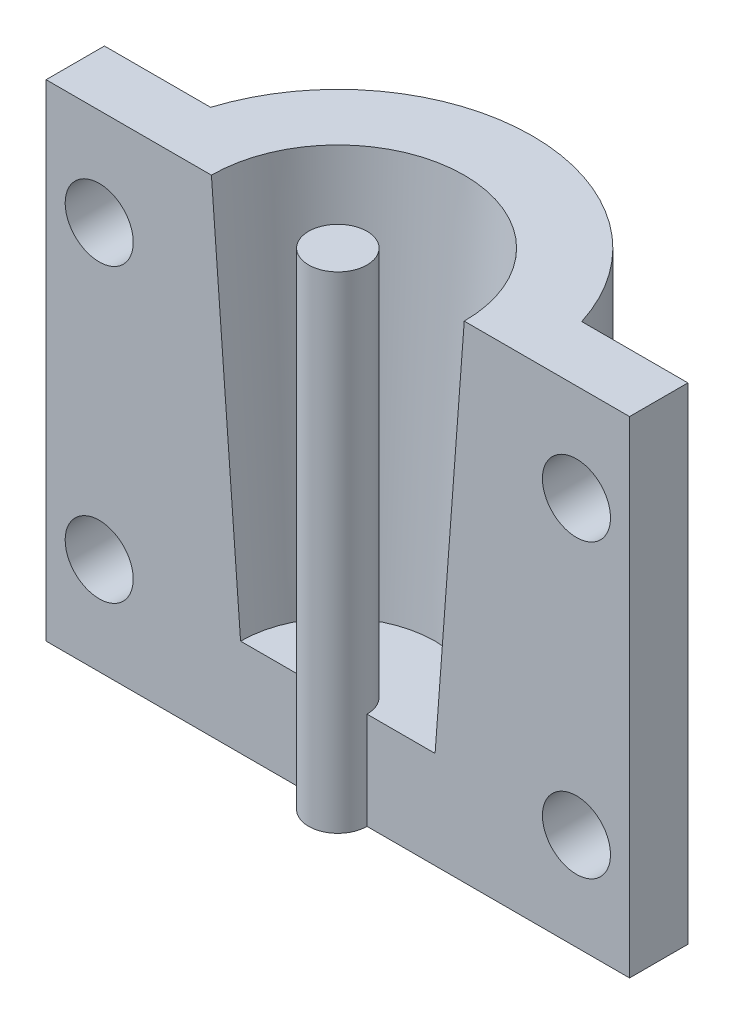
ISO-10303-21;
HEADER;
FILE_DESCRIPTION(('STEP AP214'),'2;1');
FILE_NAME('part.step','',(''),(''),'','','');
FILE_SCHEMA(('AUTOMOTIVE_DESIGN { 1 0 10303 214 1 1 1 1 }'));
ENDSEC;
DATA;
#1=APPLICATION_CONTEXT('core data for automotive mechanical design processes');
#2=APPLICATION_PROTOCOL_DEFINITION('international standard','automotive_design',2000,#1);
#3=PRODUCT_CONTEXT('',#1,'mechanical');
#4=PRODUCT('Part','Part','',(#3));
#5=PRODUCT_RELATED_PRODUCT_CATEGORY('part','',(#4));
#6=PRODUCT_DEFINITION_FORMATION('','',#4);
#7=PRODUCT_DEFINITION_CONTEXT('part definition',#1,'design');
#8=PRODUCT_DEFINITION('design','',#6,#7);
#9=PRODUCT_DEFINITION_SHAPE('','',#8);
#10=(LENGTH_UNIT() NAMED_UNIT(*) SI_UNIT(.MILLI.,.METRE.));
#11=(NAMED_UNIT(*) PLANE_ANGLE_UNIT() SI_UNIT($,.RADIAN.));
#12=(NAMED_UNIT(*) SI_UNIT($,.STERADIAN.) SOLID_ANGLE_UNIT());
#13=UNCERTAINTY_MEASURE_WITH_UNIT(LENGTH_MEASURE(1.E-05),#10,'distance_accuracy_value','');
#14=(GEOMETRIC_REPRESENTATION_CONTEXT(3) GLOBAL_UNCERTAINTY_ASSIGNED_CONTEXT((#13)) GLOBAL_UNIT_ASSIGNED_CONTEXT((#10,
#11,#12)) REPRESENTATION_CONTEXT('',''));
#15=CARTESIAN_POINT('',(0.,0.,0.));
#16=DIRECTION('',(0.,0.,1.));
#17=DIRECTION('',(1.,0.,0.));
#18=AXIS2_PLACEMENT_3D('',#15,#16,#17);
#19=CARTESIAN_POINT('',(0.,25.,0.));
#20=DIRECTION('',(0.,-1.,0.));
#21=DIRECTION('',(0.,0.,-1.));
#22=AXIS2_PLACEMENT_3D('',#19,#20,#21);
#23=CYLINDRICAL_SURFACE('',#22,10.);
#24=CARTESIAN_POINT('',(0.,25.,0.));
#25=DIRECTION('',(0.,1.,0.));
#26=DIRECTION('',(0.,0.,1.));
#27=AXIS2_PLACEMENT_3D('',#24,#25,#26);
#28=CIRCLE('',#27,10.);
#29=CARTESIAN_POINT('',(9.53939201416946,25.,-3.));
#30=VERTEX_POINT('',#29);
#31=CARTESIAN_POINT('',(-9.53939201416946,25.,-3.));
#32=VERTEX_POINT('',#31);
#33=EDGE_CURVE('E76',#30,#32,#28,.T.);
#34=ORIENTED_EDGE('',*,*,#33,.F.);
#35=DIRECTION('',(0.,-1.,0.));
#36=VECTOR('',#35,1.);
#37=CARTESIAN_POINT('',(9.53939201416946,25.,-3.));
#38=LINE('',#37,#36);
#39=CARTESIAN_POINT('',(9.53939201416946,0.,-3.));
#40=VERTEX_POINT('',#39);
#41=EDGE_CURVE('E165',#30,#40,#38,.T.);
#42=ORIENTED_EDGE('',*,*,#41,.T.);
#43=CARTESIAN_POINT('',(0.,0.,0.));
#44=DIRECTION('',(0.,1.,0.));
#45=DIRECTION('',(0.,0.,1.));
#46=AXIS2_PLACEMENT_3D('',#43,#44,#45);
#47=CIRCLE('',#46,10.);
#48=CARTESIAN_POINT('',(-9.53939201416946,0.,-3.));
#49=VERTEX_POINT('',#48);
#50=EDGE_CURVE('E311',#40,#49,#47,.T.);
#51=ORIENTED_EDGE('',*,*,#50,.T.);
#52=DIRECTION('',(0.,-1.,0.));
#53=VECTOR('',#52,1.);
#54=CARTESIAN_POINT('',(-9.53939201416946,25.,-3.));
#55=LINE('',#54,#53);
#56=EDGE_CURVE('E257',#32,#49,#55,.T.);
#57=ORIENTED_EDGE('',*,*,#56,.F.);
#58=EDGE_LOOP('',(#34,#42,#51,#57));
#59=FACE_BOUND('',#58,.T.);
#60=ADVANCED_FACE('F67',(#59),#23,.T.);
#61=CARTESIAN_POINT('',(0.,25.,0.));
#62=DIRECTION('',(0.,1.,0.));
#63=DIRECTION('',(0.,0.,1.));
#64=AXIS2_PLACEMENT_3D('',#61,#62,#63);
#65=PLANE('',#64);
#66=CARTESIAN_POINT('',(0.,25.,0.));
#67=DIRECTION('',(0.,1.,0.));
#68=DIRECTION('',(0.,0.,1.));
#69=AXIS2_PLACEMENT_3D('',#66,#67,#68);
#70=CIRCLE('',#69,6.5);
#71=CARTESIAN_POINT('',(-6.5,25.,0.));
#72=VERTEX_POINT('',#71);
#73=CARTESIAN_POINT('',(6.5,25.,0.));
#74=VERTEX_POINT('',#73);
#75=EDGE_CURVE('E149',#72,#74,#70,.F.);
#76=ORIENTED_EDGE('',*,*,#75,.T.);
#77=DIRECTION('',(-1.,0.,0.));
#78=VECTOR('',#77,1.);
#79=CARTESIAN_POINT('',(10.,25.,0.));
#80=LINE('',#79,#78);
#81=CARTESIAN_POINT('',(15.,25.,0.));
#82=VERTEX_POINT('',#81);
#83=EDGE_CURVE('E143',#82,#74,#80,.T.);
#84=ORIENTED_EDGE('',*,*,#83,.F.);
#85=DIRECTION('',(0.,0.,1.));
#86=VECTOR('',#85,1.);
#87=CARTESIAN_POINT('',(15.,25.,-3.));
#88=LINE('',#87,#86);
#89=CARTESIAN_POINT('',(15.,25.,-3.));
#90=VERTEX_POINT('',#89);
#91=EDGE_CURVE('E147',#90,#82,#88,.T.);
#92=ORIENTED_EDGE('',*,*,#91,.F.);
#93=DIRECTION('',(1.,0.,0.));
#94=VECTOR('',#93,1.);
#95=CARTESIAN_POINT('',(7.74522459408944,25.,-3.));
#96=LINE('',#95,#94);
#97=EDGE_CURVE('E172',#30,#90,#96,.T.);
#98=ORIENTED_EDGE('',*,*,#97,.F.);
#99=ORIENTED_EDGE('',*,*,#33,.T.);
#100=DIRECTION('',(-1.,0.,0.));
#101=VECTOR('',#100,1.);
#102=CARTESIAN_POINT('',(-7.74522459408944,25.,-3.));
#103=LINE('',#102,#101);
#104=CARTESIAN_POINT('',(-15.,25.,-3.));
#105=VERTEX_POINT('',#104);
#106=EDGE_CURVE('E234',#32,#105,#103,.T.);
#107=ORIENTED_EDGE('',*,*,#106,.T.);
#108=DIRECTION('',(0.,0.,1.));
#109=VECTOR('',#108,1.);
#110=CARTESIAN_POINT('',(-15.,25.,-3.));
#111=LINE('',#110,#109);
#112=CARTESIAN_POINT('',(-15.,25.,0.));
#113=VERTEX_POINT('',#112);
#114=EDGE_CURVE('E237',#105,#113,#111,.T.);
#115=ORIENTED_EDGE('',*,*,#114,.T.);
#116=DIRECTION('',(1.,0.,0.));
#117=VECTOR('',#116,1.);
#118=CARTESIAN_POINT('',(-7.74522459408944,25.,0.));
#119=LINE('',#118,#117);
#120=EDGE_CURVE('E241',#113,#72,#119,.T.);
#121=ORIENTED_EDGE('',*,*,#120,.T.);
#122=EDGE_LOOP('',(#76,#84,#92,#98,#99,#107,#115,#121));
#123=FACE_BOUND('',#122,.T.);
#124=ADVANCED_FACE('F145',(#123),#65,.T.);
#125=CARTESIAN_POINT('',(0.,0.,0.));
#126=DIRECTION('',(0.,1.,0.));
#127=DIRECTION('',(0.,0.,1.));
#128=AXIS2_PLACEMENT_3D('',#125,#126,#127);
#129=PLANE('',#128);
#130=DIRECTION('',(-1.,0.,0.));
#131=VECTOR('',#130,1.);
#132=CARTESIAN_POINT('',(10.,0.,0.));
#133=LINE('',#132,#131);
#134=CARTESIAN_POINT('',(15.,0.,0.));
#135=VERTEX_POINT('',#134);
#136=CARTESIAN_POINT('',(1.5,0.,0.));
#137=VERTEX_POINT('',#136);
#138=EDGE_CURVE('E160',#135,#137,#133,.T.);
#139=ORIENTED_EDGE('',*,*,#138,.T.);
#140=CARTESIAN_POINT('',(0.,0.,0.));
#141=DIRECTION('',(0.,-1.,0.));
#142=DIRECTION('',(0.,0.,1.));
#143=AXIS2_PLACEMENT_3D('',#140,#141,#142);
#144=CIRCLE('',#143,1.5);
#145=CARTESIAN_POINT('',(-1.5,0.,0.));
#146=VERTEX_POINT('',#145);
#147=EDGE_CURVE('E154',#137,#146,#144,.T.);
#148=ORIENTED_EDGE('',*,*,#147,.T.);
#149=DIRECTION('',(1.,0.,0.));
#150=VECTOR('',#149,1.);
#151=CARTESIAN_POINT('',(-7.74522459408944,0.,0.));
#152=LINE('',#151,#150);
#153=CARTESIAN_POINT('',(-15.,0.,0.));
#154=VERTEX_POINT('',#153);
#155=EDGE_CURVE('E238',#154,#146,#152,.T.);
#156=ORIENTED_EDGE('',*,*,#155,.F.);
#157=DIRECTION('',(0.,0.,1.));
#158=VECTOR('',#157,1.);
#159=CARTESIAN_POINT('',(-15.,0.,-3.));
#160=LINE('',#159,#158);
#161=CARTESIAN_POINT('',(-15.,0.,-3.));
#162=VERTEX_POINT('',#161);
#163=EDGE_CURVE('E244',#162,#154,#160,.T.);
#164=ORIENTED_EDGE('',*,*,#163,.F.);
#165=DIRECTION('',(-1.,0.,0.));
#166=VECTOR('',#165,1.);
#167=CARTESIAN_POINT('',(-7.74522459408944,0.,-3.));
#168=LINE('',#167,#166);
#169=EDGE_CURVE('E231',#49,#162,#168,.T.);
#170=ORIENTED_EDGE('',*,*,#169,.F.);
#171=ORIENTED_EDGE('',*,*,#50,.F.);
#172=DIRECTION('',(1.,0.,0.));
#173=VECTOR('',#172,1.);
#174=CARTESIAN_POINT('',(7.74522459408944,0.,-3.));
#175=LINE('',#174,#173);
#176=CARTESIAN_POINT('',(15.,0.,-3.));
#177=VERTEX_POINT('',#176);
#178=EDGE_CURVE('E173',#40,#177,#175,.T.);
#179=ORIENTED_EDGE('',*,*,#178,.T.);
#180=DIRECTION('',(0.,0.,1.));
#181=VECTOR('',#180,1.);
#182=CARTESIAN_POINT('',(15.,0.,-3.));
#183=LINE('',#182,#181);
#184=EDGE_CURVE('E178',#177,#135,#183,.T.);
#185=ORIENTED_EDGE('',*,*,#184,.T.);
#186=EDGE_LOOP('',(#139,#148,#156,#164,#170,#171,#179,#185));
#187=FACE_BOUND('',#186,.T.);
#188=ADVANCED_FACE('F285',(#187),#129,.F.);
#189=CARTESIAN_POINT('',(0.,5.,0.));
#190=DIRECTION('',(0.,1.,0.));
#191=DIRECTION('',(0.,0.,1.));
#192=AXIS2_PLACEMENT_3D('',#189,#190,#191);
#193=CONICAL_SURFACE('',#192,5.,0.0748598477107669);
#194=CARTESIAN_POINT('',(0.,5.,0.));
#195=DIRECTION('',(0.,1.,0.));
#196=DIRECTION('',(0.,0.,1.));
#197=AXIS2_PLACEMENT_3D('',#194,#195,#196);
#198=CIRCLE('',#197,5.);
#199=CARTESIAN_POINT('',(-5.00008660902664,5.,1.66282445554639E-07));
#200=VERTEX_POINT('',#199);
#201=CARTESIAN_POINT('',(5.00008660984891,5.,-1.67465392185179E-07));
#202=VERTEX_POINT('',#201);
#203=EDGE_CURVE('E265',#200,#202,#198,.F.);
#204=ORIENTED_EDGE('',*,*,#203,.T.);
#205=DIRECTION('',(-0.0747899482416342,-0.997199309888456,0.));
#206=VECTOR('',#205,1.);
#207=CARTESIAN_POINT('',(0.,-61.6666666666667,0.));
#208=LINE('',#207,#206);
#209=EDGE_CURVE('E226',#202,#74,#208,.F.);
#210=ORIENTED_EDGE('',*,*,#209,.T.);
#211=ORIENTED_EDGE('',*,*,#75,.F.);
#212=DIRECTION('',(-0.0747899482416342,0.997199309888456,0.));
#213=VECTOR('',#212,1.);
#214=CARTESIAN_POINT('',(0.,-61.6666666666667,0.));
#215=LINE('',#214,#213);
#216=EDGE_CURVE('E214',#72,#200,#215,.F.);
#217=ORIENTED_EDGE('',*,*,#216,.T.);
#218=EDGE_LOOP('',(#204,#210,#211,#217));
#219=FACE_BOUND('',#218,.T.);
#220=ADVANCED_FACE('F274',(#219),#193,.F.);
#221=CARTESIAN_POINT('',(0.,5.,0.));
#222=DIRECTION('',(0.,-1.,0.));
#223=DIRECTION('',(0.,0.,-1.));
#224=AXIS2_PLACEMENT_3D('',#221,#222,#223);
#225=PLANE('',#224);
#226=CARTESIAN_POINT('',(0.,5.,0.));
#227=DIRECTION('',(0.,-1.,0.));
#228=DIRECTION('',(0.,0.,-1.));
#229=AXIS2_PLACEMENT_3D('',#226,#227,#228);
#230=CIRCLE('',#229,1.5);
#231=CARTESIAN_POINT('',(1.5,5.,0.));
#232=VERTEX_POINT('',#231);
#233=CARTESIAN_POINT('',(-1.5,5.,0.));
#234=VERTEX_POINT('',#233);
#235=EDGE_CURVE('E12',#232,#234,#230,.F.);
#236=ORIENTED_EDGE('',*,*,#235,.F.);
#237=DIRECTION('',(1.,0.,0.));
#238=VECTOR('',#237,1.);
#239=CARTESIAN_POINT('',(0.,5.,0.));
#240=LINE('',#239,#238);
#241=EDGE_CURVE('E220',#232,#202,#240,.T.);
#242=ORIENTED_EDGE('',*,*,#241,.T.);
#243=ORIENTED_EDGE('',*,*,#203,.F.);
#244=DIRECTION('',(1.,0.,0.));
#245=VECTOR('',#244,1.);
#246=CARTESIAN_POINT('',(0.,5.,0.));
#247=LINE('',#246,#245);
#248=EDGE_CURVE('E210',#200,#234,#247,.T.);
#249=ORIENTED_EDGE('',*,*,#248,.T.);
#250=EDGE_LOOP('',(#236,#242,#243,#249));
#251=FACE_BOUND('',#250,.T.);
#252=ADVANCED_FACE('F284',(#251),#225,.F.);
#253=CARTESIAN_POINT('',(0.,25.,0.));
#254=DIRECTION('',(0.,-1.,0.));
#255=DIRECTION('',(0.,0.,-1.));
#256=AXIS2_PLACEMENT_3D('',#253,#254,#255);
#257=CYLINDRICAL_SURFACE('',#256,1.5);
#258=ORIENTED_EDGE('',*,*,#235,.T.);
#259=DIRECTION('',(0.,1.,0.));
#260=VECTOR('',#259,1.);
#261=CARTESIAN_POINT('',(-1.5,0.,0.));
#262=LINE('',#261,#260);
#263=EDGE_CURVE('E204',#146,#234,#262,.T.);
#264=ORIENTED_EDGE('',*,*,#263,.F.);
#265=ORIENTED_EDGE('',*,*,#147,.F.);
#266=DIRECTION('',(0.,1.,0.));
#267=VECTOR('',#266,1.);
#268=CARTESIAN_POINT('',(1.5,0.,0.));
#269=LINE('',#268,#267);
#270=EDGE_CURVE('E207',#137,#232,#269,.T.);
#271=ORIENTED_EDGE('',*,*,#270,.T.);
#272=EDGE_LOOP('',(#258,#264,#265,#271));
#273=FACE_BOUND('',#272,.T.);
#274=CARTESIAN_POINT('',(0.,25.,0.));
#275=DIRECTION('',(0.,1.,0.));
#276=DIRECTION('',(0.,0.,1.));
#277=AXIS2_PLACEMENT_3D('',#274,#275,#276);
#278=CIRCLE('',#277,1.5);
#279=CARTESIAN_POINT('',(0.,25.,1.5));
#280=VERTEX_POINT('',#279);
#281=EDGE_CURVE('E261',#280,#280,#278,.T.);
#282=ORIENTED_EDGE('',*,*,#281,.F.);
#283=EDGE_LOOP('',(#282));
#284=FACE_BOUND('',#283,.T.);
#285=ADVANCED_FACE('F357',(#273,#284),#257,.T.);
#286=CARTESIAN_POINT('',(0.,25.,0.));
#287=DIRECTION('',(0.,1.,0.));
#288=DIRECTION('',(0.,0.,1.));
#289=AXIS2_PLACEMENT_3D('',#286,#287,#288);
#290=PLANE('',#289);
#291=ORIENTED_EDGE('',*,*,#281,.T.);
#292=EDGE_LOOP('',(#291));
#293=FACE_BOUND('',#292,.T.);
#294=ADVANCED_FACE('F396',(#293),#290,.T.);
#295=CARTESIAN_POINT('',(-7.74522459408944,25.,-3.));
#296=DIRECTION('',(0.,0.,1.));
#297=DIRECTION('',(1.,0.,0.));
#298=AXIS2_PLACEMENT_3D('',#295,#296,#297);
#299=PLANE('',#298);
#300=CARTESIAN_POINT('',(-12.2696960070847,5.,-3.));
#301=DIRECTION('',(0.,0.,-1.));
#302=DIRECTION('',(-1.,0.,0.));
#303=AXIS2_PLACEMENT_3D('',#300,#301,#302);
#304=CIRCLE('',#303,1.75);
#305=CARTESIAN_POINT('',(-14.0196960070847,5.,-3.));
#306=VERTEX_POINT('',#305);
#307=EDGE_CURVE('E191',#306,#306,#304,.T.);
#308=ORIENTED_EDGE('',*,*,#307,.F.);
#309=EDGE_LOOP('',(#308));
#310=FACE_BOUND('',#309,.T.);
#311=CARTESIAN_POINT('',(-12.2696960070847,20.,-3.));
#312=DIRECTION('',(0.,0.,-1.));
#313=DIRECTION('',(-1.,0.,0.));
#314=AXIS2_PLACEMENT_3D('',#311,#312,#313);
#315=CIRCLE('',#314,1.75);
#316=CARTESIAN_POINT('',(-14.0196960070847,20.,-3.));
#317=VERTEX_POINT('',#316);
#318=EDGE_CURVE('E190',#317,#317,#315,.T.);
#319=ORIENTED_EDGE('',*,*,#318,.F.);
#320=EDGE_LOOP('',(#319));
#321=FACE_BOUND('',#320,.T.);
#322=ORIENTED_EDGE('',*,*,#106,.F.);
#323=ORIENTED_EDGE('',*,*,#56,.T.);
#324=ORIENTED_EDGE('',*,*,#169,.T.);
#325=DIRECTION('',(0.,-1.,0.));
#326=VECTOR('',#325,1.);
#327=CARTESIAN_POINT('',(-15.,25.,-3.));
#328=LINE('',#327,#326);
#329=EDGE_CURVE('E253',#105,#162,#328,.T.);
#330=ORIENTED_EDGE('',*,*,#329,.F.);
#331=EDGE_LOOP('',(#322,#323,#324,#330));
#332=FACE_BOUND('',#331,.T.);
#333=ADVANCED_FACE('F374',(#310,#321,#332),#299,.F.);
#334=CARTESIAN_POINT('',(-7.74522459408944,25.,0.));
#335=DIRECTION('',(0.,0.,-1.));
#336=DIRECTION('',(-1.,0.,0.));
#337=AXIS2_PLACEMENT_3D('',#334,#335,#336);
#338=PLANE('',#337);
#339=CARTESIAN_POINT('',(-12.2696960070847,5.,0.));
#340=DIRECTION('',(0.,0.,-1.));
#341=DIRECTION('',(-1.,0.,0.));
#342=AXIS2_PLACEMENT_3D('',#339,#340,#341);
#343=CIRCLE('',#342,1.75);
#344=CARTESIAN_POINT('',(-14.0196960070847,5.,0.));
#345=VERTEX_POINT('',#344);
#346=EDGE_CURVE('E70',#345,#345,#343,.T.);
#347=ORIENTED_EDGE('',*,*,#346,.T.);
#348=EDGE_LOOP('',(#347));
#349=FACE_BOUND('',#348,.T.);
#350=CARTESIAN_POINT('',(-12.2696960070847,20.,0.));
#351=DIRECTION('',(0.,0.,-1.));
#352=DIRECTION('',(-1.,0.,0.));
#353=AXIS2_PLACEMENT_3D('',#350,#351,#352);
#354=CIRCLE('',#353,1.75);
#355=CARTESIAN_POINT('',(-14.0196960070847,20.,0.));
#356=VERTEX_POINT('',#355);
#357=EDGE_CURVE('E195',#356,#356,#354,.T.);
#358=ORIENTED_EDGE('',*,*,#357,.T.);
#359=EDGE_LOOP('',(#358));
#360=FACE_BOUND('',#359,.T.);
#361=ORIENTED_EDGE('',*,*,#155,.T.);
#362=ORIENTED_EDGE('',*,*,#263,.T.);
#363=ORIENTED_EDGE('',*,*,#248,.F.);
#364=ORIENTED_EDGE('',*,*,#216,.F.);
#365=ORIENTED_EDGE('',*,*,#120,.F.);
#366=DIRECTION('',(0.,-1.,0.));
#367=VECTOR('',#366,1.);
#368=CARTESIAN_POINT('',(-15.,25.,0.));
#369=LINE('',#368,#367);
#370=EDGE_CURVE('E249',#113,#154,#369,.T.);
#371=ORIENTED_EDGE('',*,*,#370,.T.);
#372=EDGE_LOOP('',(#361,#362,#363,#364,#365,#371));
#373=FACE_BOUND('',#372,.T.);
#374=ADVANCED_FACE('F323',(#349,#360,#373),#338,.F.);
#375=CARTESIAN_POINT('',(-15.,25.,-3.));
#376=DIRECTION('',(1.,0.,0.));
#377=DIRECTION('',(0.,0.,-1.));
#378=AXIS2_PLACEMENT_3D('',#375,#376,#377);
#379=PLANE('',#378);
#380=ORIENTED_EDGE('',*,*,#163,.T.);
#381=ORIENTED_EDGE('',*,*,#370,.F.);
#382=ORIENTED_EDGE('',*,*,#114,.F.);
#383=ORIENTED_EDGE('',*,*,#329,.T.);
#384=EDGE_LOOP('',(#380,#381,#382,#383));
#385=FACE_BOUND('',#384,.T.);
#386=ADVANCED_FACE('F379',(#385),#379,.F.);
#387=CARTESIAN_POINT('',(10.,0.,0.));
#388=DIRECTION('',(0.,0.,-1.));
#389=DIRECTION('',(-1.,0.,0.));
#390=AXIS2_PLACEMENT_3D('',#387,#388,#389);
#391=PLANE('',#390);
#392=CARTESIAN_POINT('',(12.2696960070847,5.,0.));
#393=DIRECTION('',(0.,0.,-1.));
#394=DIRECTION('',(-1.,0.,0.));
#395=AXIS2_PLACEMENT_3D('',#392,#393,#394);
#396=CIRCLE('',#395,1.75);
#397=CARTESIAN_POINT('',(10.5196960070847,5.,0.));
#398=VERTEX_POINT('',#397);
#399=EDGE_CURVE('E181',#398,#398,#396,.F.);
#400=ORIENTED_EDGE('',*,*,#399,.F.);
#401=EDGE_LOOP('',(#400));
#402=FACE_BOUND('',#401,.T.);
#403=CARTESIAN_POINT('',(12.2696960070847,20.,0.));
#404=DIRECTION('',(0.,0.,-1.));
#405=DIRECTION('',(-1.,0.,0.));
#406=AXIS2_PLACEMENT_3D('',#403,#404,#405);
#407=CIRCLE('',#406,1.75);
#408=CARTESIAN_POINT('',(10.5196960070847,20.,0.));
#409=VERTEX_POINT('',#408);
#410=EDGE_CURVE('E419',#409,#409,#407,.F.);
#411=ORIENTED_EDGE('',*,*,#410,.F.);
#412=EDGE_LOOP('',(#411));
#413=FACE_BOUND('',#412,.T.);
#414=ORIENTED_EDGE('',*,*,#270,.F.);
#415=ORIENTED_EDGE('',*,*,#138,.F.);
#416=DIRECTION('',(0.,-1.,0.));
#417=VECTOR('',#416,1.);
#418=CARTESIAN_POINT('',(15.,25.,0.));
#419=LINE('',#418,#417);
#420=EDGE_CURVE('E157',#82,#135,#419,.T.);
#421=ORIENTED_EDGE('',*,*,#420,.F.);
#422=ORIENTED_EDGE('',*,*,#83,.T.);
#423=ORIENTED_EDGE('',*,*,#209,.F.);
#424=ORIENTED_EDGE('',*,*,#241,.F.);
#425=EDGE_LOOP('',(#414,#415,#421,#422,#423,#424));
#426=FACE_BOUND('',#425,.T.);
#427=ADVANCED_FACE('F159',(#402,#413,#426),#391,.F.);
#428=CARTESIAN_POINT('',(-12.2696960070847,20.,1.50000000000001));
#429=DIRECTION('',(0.,0.,-1.));
#430=DIRECTION('',(-1.,0.,0.));
#431=AXIS2_PLACEMENT_3D('',#428,#429,#430);
#432=CYLINDRICAL_SURFACE('',#431,1.75);
#433=ORIENTED_EDGE('',*,*,#318,.T.);
#434=EDGE_LOOP('',(#433));
#435=FACE_BOUND('',#434,.T.);
#436=ORIENTED_EDGE('',*,*,#357,.F.);
#437=EDGE_LOOP('',(#436));
#438=FACE_BOUND('',#437,.T.);
#439=ADVANCED_FACE('F328',(#435,#438),#432,.F.);
#440=CARTESIAN_POINT('',(-12.2696960070847,5.,1.50000000000001));
#441=DIRECTION('',(0.,0.,-1.));
#442=DIRECTION('',(-1.,0.,0.));
#443=AXIS2_PLACEMENT_3D('',#440,#441,#442);
#444=CYLINDRICAL_SURFACE('',#443,1.75);
#445=ORIENTED_EDGE('',*,*,#307,.T.);
#446=EDGE_LOOP('',(#445));
#447=FACE_BOUND('',#446,.T.);
#448=ORIENTED_EDGE('',*,*,#346,.F.);
#449=EDGE_LOOP('',(#448));
#450=FACE_BOUND('',#449,.T.);
#451=ADVANCED_FACE('F325',(#447,#450),#444,.F.);
#452=CARTESIAN_POINT('',(7.74522459408944,25.,-3.));
#453=DIRECTION('',(0.,0.,-1.));
#454=DIRECTION('',(-1.,0.,0.));
#455=AXIS2_PLACEMENT_3D('',#452,#453,#454);
#456=PLANE('',#455);
#457=CARTESIAN_POINT('',(12.2696960070847,5.,-3.));
#458=DIRECTION('',(0.,0.,1.));
#459=DIRECTION('',(1.,0.,0.));
#460=AXIS2_PLACEMENT_3D('',#457,#458,#459);
#461=CIRCLE('',#460,1.75);
#462=CARTESIAN_POINT('',(14.0196960070847,5.,-3.));
#463=VERTEX_POINT('',#462);
#464=EDGE_CURVE('E422',#463,#463,#461,.T.);
#465=ORIENTED_EDGE('',*,*,#464,.T.);
#466=EDGE_LOOP('',(#465));
#467=FACE_BOUND('',#466,.T.);
#468=CARTESIAN_POINT('',(12.2696960070847,20.,-3.));
#469=DIRECTION('',(0.,0.,1.));
#470=DIRECTION('',(1.,0.,0.));
#471=AXIS2_PLACEMENT_3D('',#468,#469,#470);
#472=CIRCLE('',#471,1.75);
#473=CARTESIAN_POINT('',(14.0196960070847,20.,-3.));
#474=VERTEX_POINT('',#473);
#475=EDGE_CURVE('E426',#474,#474,#472,.T.);
#476=ORIENTED_EDGE('',*,*,#475,.T.);
#477=EDGE_LOOP('',(#476));
#478=FACE_BOUND('',#477,.T.);
#479=ORIENTED_EDGE('',*,*,#41,.F.);
#480=ORIENTED_EDGE('',*,*,#97,.T.);
#481=DIRECTION('',(0.,-1.,0.));
#482=VECTOR('',#481,1.);
#483=CARTESIAN_POINT('',(15.,25.,-3.));
#484=LINE('',#483,#482);
#485=EDGE_CURVE('E166',#90,#177,#484,.T.);
#486=ORIENTED_EDGE('',*,*,#485,.T.);
#487=ORIENTED_EDGE('',*,*,#178,.F.);
#488=EDGE_LOOP('',(#479,#480,#486,#487));
#489=FACE_BOUND('',#488,.T.);
#490=ADVANCED_FACE('F327',(#467,#478,#489),#456,.T.);
#491=CARTESIAN_POINT('',(15.,25.,-3.));
#492=DIRECTION('',(1.,0.,0.));
#493=DIRECTION('',(0.,0.,-1.));
#494=AXIS2_PLACEMENT_3D('',#491,#492,#493);
#495=PLANE('',#494);
#496=ORIENTED_EDGE('',*,*,#184,.F.);
#497=ORIENTED_EDGE('',*,*,#485,.F.);
#498=ORIENTED_EDGE('',*,*,#91,.T.);
#499=ORIENTED_EDGE('',*,*,#420,.T.);
#500=EDGE_LOOP('',(#496,#497,#498,#499));
#501=FACE_BOUND('',#500,.T.);
#502=ADVANCED_FACE('F169',(#501),#495,.T.);
#503=CARTESIAN_POINT('',(12.2696960070847,20.,1.50000000000001));
#504=DIRECTION('',(0.,0.,-1.));
#505=DIRECTION('',(-1.,0.,0.));
#506=AXIS2_PLACEMENT_3D('',#503,#504,#505);
#507=CYLINDRICAL_SURFACE('',#506,1.75);
#508=ORIENTED_EDGE('',*,*,#475,.F.);
#509=EDGE_LOOP('',(#508));
#510=FACE_BOUND('',#509,.T.);
#511=ORIENTED_EDGE('',*,*,#410,.T.);
#512=EDGE_LOOP('',(#511));
#513=FACE_BOUND('',#512,.T.);
#514=ADVANCED_FACE('F435',(#510,#513),#507,.F.);
#515=CARTESIAN_POINT('',(12.2696960070847,5.,1.50000000000001));
#516=DIRECTION('',(0.,0.,-1.));
#517=DIRECTION('',(-1.,0.,0.));
#518=AXIS2_PLACEMENT_3D('',#515,#516,#517);
#519=CYLINDRICAL_SURFACE('',#518,1.75);
#520=ORIENTED_EDGE('',*,*,#464,.F.);
#521=EDGE_LOOP('',(#520));
#522=FACE_BOUND('',#521,.T.);
#523=ORIENTED_EDGE('',*,*,#399,.T.);
#524=EDGE_LOOP('',(#523));
#525=FACE_BOUND('',#524,.T.);
#526=ADVANCED_FACE('F437',(#522,#525),#519,.F.);
#527=CLOSED_SHELL('',(#60,#124,#188,#220,#252,#285,#294,#333,#374,#386,#427,#439,#451,#490,#502,
#514,#526));
#528=MANIFOLD_SOLID_BREP('B2',#527);
#529=ADVANCED_BREP_SHAPE_REPRESENTATION('',(#18,#528),#14);
#530=SHAPE_DEFINITION_REPRESENTATION(#9,#529);
ENDSEC;
END-ISO-10303-21;
